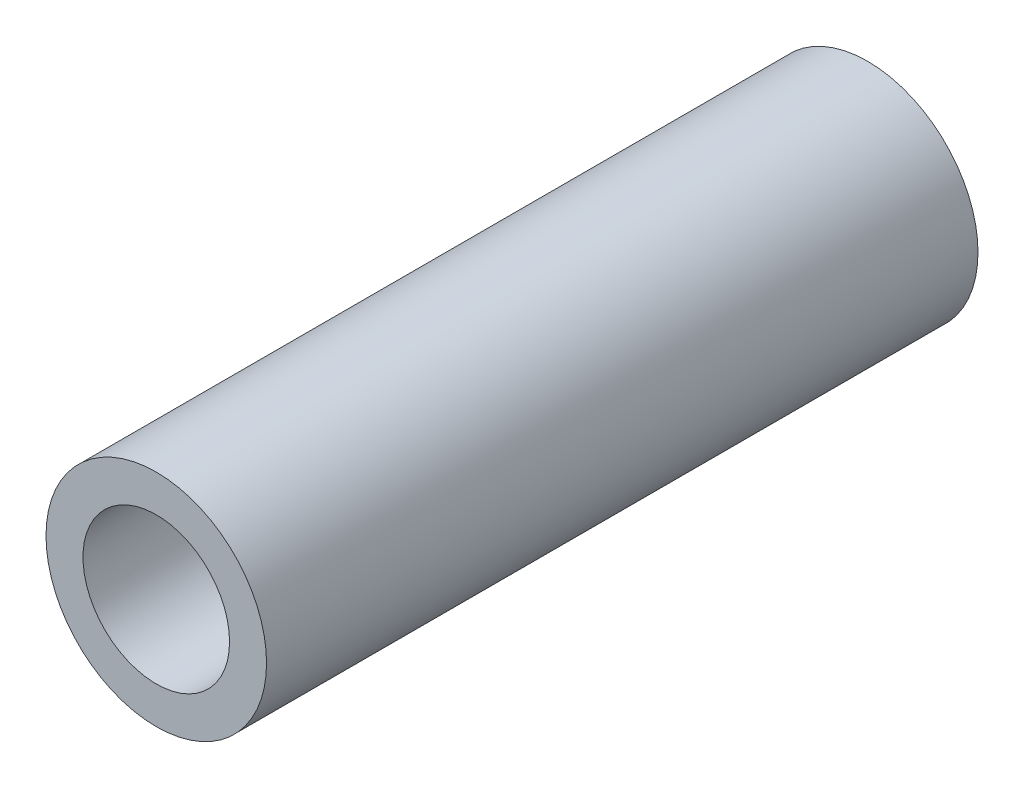
ISO-10303-21;
HEADER;
FILE_DESCRIPTION(('STEP AP214'),'2;1');
FILE_NAME('part.step','',(''),(''),'','','');
FILE_SCHEMA(('AUTOMOTIVE_DESIGN { 1 0 10303 214 1 1 1 1 }'));
ENDSEC;
DATA;
#1=APPLICATION_CONTEXT('core data for automotive mechanical design processes');
#2=APPLICATION_PROTOCOL_DEFINITION('international standard','automotive_design',2000,#1);
#3=PRODUCT_CONTEXT('',#1,'mechanical');
#4=PRODUCT('Part','Part','',(#3));
#5=PRODUCT_RELATED_PRODUCT_CATEGORY('part','',(#4));
#6=PRODUCT_DEFINITION_FORMATION('','',#4);
#7=PRODUCT_DEFINITION_CONTEXT('part definition',#1,'design');
#8=PRODUCT_DEFINITION('design','',#6,#7);
#9=PRODUCT_DEFINITION_SHAPE('','',#8);
#10=(LENGTH_UNIT() NAMED_UNIT(*) SI_UNIT(.MILLI.,.METRE.));
#11=(NAMED_UNIT(*) PLANE_ANGLE_UNIT() SI_UNIT($,.RADIAN.));
#12=(NAMED_UNIT(*) SI_UNIT($,.STERADIAN.) SOLID_ANGLE_UNIT());
#13=UNCERTAINTY_MEASURE_WITH_UNIT(LENGTH_MEASURE(1.E-05),#10,'distance_accuracy_value','');
#14=(GEOMETRIC_REPRESENTATION_CONTEXT(3) GLOBAL_UNCERTAINTY_ASSIGNED_CONTEXT((#13)) GLOBAL_UNIT_ASSIGNED_CONTEXT((#10,
#11,#12)) REPRESENTATION_CONTEXT('',''));
#15=CARTESIAN_POINT('',(0.,0.,0.));
#16=DIRECTION('',(0.,0.,1.));
#17=DIRECTION('',(1.,0.,0.));
#18=AXIS2_PLACEMENT_3D('',#15,#16,#17);
#19=CARTESIAN_POINT('',(0.,0.,20.));
#20=DIRECTION('',(0.,0.,1.));
#21=DIRECTION('',(1.,0.,0.));
#22=AXIS2_PLACEMENT_3D('',#19,#20,#21);
#23=PLANE('',#22);
#24=CARTESIAN_POINT('',(0.,0.,20.));
#25=DIRECTION('',(0.,0.,1.));
#26=DIRECTION('',(1.,0.,0.));
#27=AXIS2_PLACEMENT_3D('',#24,#25,#26);
#28=CIRCLE('',#27,3.1);
#29=CARTESIAN_POINT('',(3.1,0.,20.));
#30=VERTEX_POINT('',#29);
#31=EDGE_CURVE('E10',#30,#30,#28,.T.);
#32=ORIENTED_EDGE('',*,*,#31,.T.);
#33=EDGE_LOOP('',(#32));
#34=FACE_BOUND('',#33,.T.);
#35=CARTESIAN_POINT('',(0.,0.,20.));
#36=DIRECTION('',(0.,0.,1.));
#37=DIRECTION('',(1.,0.,0.));
#38=AXIS2_PLACEMENT_3D('',#35,#36,#37);
#39=CIRCLE('',#38,2.06);
#40=CARTESIAN_POINT('',(2.06,0.,20.));
#41=VERTEX_POINT('',#40);
#42=EDGE_CURVE('E50',#41,#41,#39,.T.);
#43=ORIENTED_EDGE('',*,*,#42,.F.);
#44=EDGE_LOOP('',(#43));
#45=FACE_BOUND('',#44,.T.);
#46=ADVANCED_FACE('F39',(#34,#45),#23,.T.);
#47=CARTESIAN_POINT('',(0.,0.,0.));
#48=DIRECTION('',(0.,0.,1.));
#49=DIRECTION('',(1.,0.,0.));
#50=AXIS2_PLACEMENT_3D('',#47,#48,#49);
#51=PLANE('',#50);
#52=CARTESIAN_POINT('',(0.,0.,0.));
#53=DIRECTION('',(0.,0.,1.));
#54=DIRECTION('',(1.,0.,0.));
#55=AXIS2_PLACEMENT_3D('',#52,#53,#54);
#56=CIRCLE('',#55,3.1);
#57=CARTESIAN_POINT('',(3.1,0.,0.));
#58=VERTEX_POINT('',#57);
#59=EDGE_CURVE('E43',#58,#58,#56,.T.);
#60=ORIENTED_EDGE('',*,*,#59,.F.);
#61=EDGE_LOOP('',(#60));
#62=FACE_BOUND('',#61,.T.);
#63=CARTESIAN_POINT('',(0.,0.,0.));
#64=DIRECTION('',(0.,0.,1.));
#65=DIRECTION('',(1.,0.,0.));
#66=AXIS2_PLACEMENT_3D('',#63,#64,#65);
#67=CIRCLE('',#66,2.06);
#68=CARTESIAN_POINT('',(2.06,0.,0.));
#69=VERTEX_POINT('',#68);
#70=EDGE_CURVE('E52',#69,#69,#67,.T.);
#71=ORIENTED_EDGE('',*,*,#70,.T.);
#72=EDGE_LOOP('',(#71));
#73=FACE_BOUND('',#72,.T.);
#74=ADVANCED_FACE('F62',(#62,#73),#51,.F.);
#75=CARTESIAN_POINT('',(0.,0.,20.));
#76=DIRECTION('',(0.,0.,-1.));
#77=DIRECTION('',(-1.,0.,0.));
#78=AXIS2_PLACEMENT_3D('',#75,#76,#77);
#79=CYLINDRICAL_SURFACE('',#78,3.1);
#80=ORIENTED_EDGE('',*,*,#31,.F.);
#81=EDGE_LOOP('',(#80));
#82=FACE_BOUND('',#81,.T.);
#83=ORIENTED_EDGE('',*,*,#59,.T.);
#84=EDGE_LOOP('',(#83));
#85=FACE_BOUND('',#84,.T.);
#86=ADVANCED_FACE('F41',(#82,#85),#79,.T.);
#87=CARTESIAN_POINT('',(0.,0.,20.));
#88=DIRECTION('',(0.,0.,-1.));
#89=DIRECTION('',(-1.,0.,0.));
#90=AXIS2_PLACEMENT_3D('',#87,#88,#89);
#91=CYLINDRICAL_SURFACE('',#90,2.06);
#92=ORIENTED_EDGE('',*,*,#42,.T.);
#93=EDGE_LOOP('',(#92));
#94=FACE_BOUND('',#93,.T.);
#95=ORIENTED_EDGE('',*,*,#70,.F.);
#96=EDGE_LOOP('',(#95));
#97=FACE_BOUND('',#96,.T.);
#98=ADVANCED_FACE('F58',(#94,#97),#91,.F.);
#99=CLOSED_SHELL('',(#46,#74,#86,#98));
#100=MANIFOLD_SOLID_BREP('B2',#99);
#101=ADVANCED_BREP_SHAPE_REPRESENTATION('',(#18,#100),#14);
#102=SHAPE_DEFINITION_REPRESENTATION(#9,#101);
ENDSEC;
END-ISO-10303-21;
